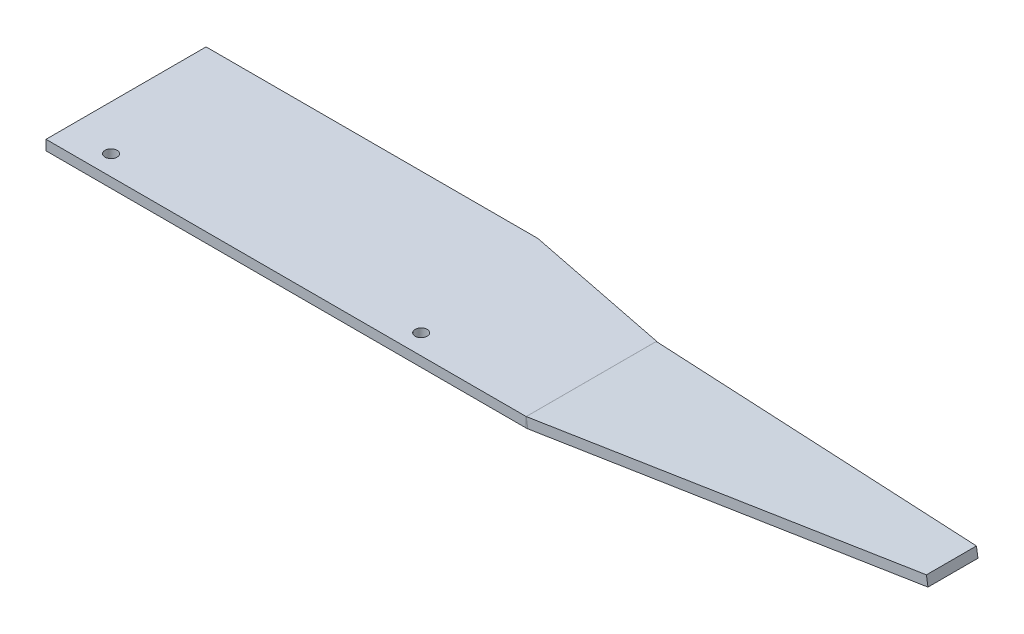
ISO-10303-21;
HEADER;
FILE_DESCRIPTION(('STEP AP214'),'2;1');
FILE_NAME('part.step','',(''),(''),'','','');
FILE_SCHEMA(('AUTOMOTIVE_DESIGN { 1 0 10303 214 1 1 1 1 }'));
ENDSEC;
DATA;
#1=APPLICATION_CONTEXT('core data for automotive mechanical design processes');
#2=APPLICATION_PROTOCOL_DEFINITION('international standard','automotive_design',2000,#1);
#3=PRODUCT_CONTEXT('',#1,'mechanical');
#4=PRODUCT('Part','Part','',(#3));
#5=PRODUCT_RELATED_PRODUCT_CATEGORY('part','',(#4));
#6=PRODUCT_DEFINITION_FORMATION('','',#4);
#7=PRODUCT_DEFINITION_CONTEXT('part definition',#1,'design');
#8=PRODUCT_DEFINITION('design','',#6,#7);
#9=PRODUCT_DEFINITION_SHAPE('','',#8);
#10=(LENGTH_UNIT() NAMED_UNIT(*) SI_UNIT(.MILLI.,.METRE.));
#11=(NAMED_UNIT(*) PLANE_ANGLE_UNIT() SI_UNIT($,.RADIAN.));
#12=(NAMED_UNIT(*) SI_UNIT($,.STERADIAN.) SOLID_ANGLE_UNIT());
#13=UNCERTAINTY_MEASURE_WITH_UNIT(LENGTH_MEASURE(1.E-05),#10,'distance_accuracy_value','');
#14=(GEOMETRIC_REPRESENTATION_CONTEXT(3) GLOBAL_UNCERTAINTY_ASSIGNED_CONTEXT((#13)) GLOBAL_UNIT_ASSIGNED_CONTEXT((#10,
#11,#12)) REPRESENTATION_CONTEXT('',''));
#15=CARTESIAN_POINT('',(0.,0.,0.));
#16=DIRECTION('',(0.,0.,1.));
#17=DIRECTION('',(1.,0.,0.));
#18=AXIS2_PLACEMENT_3D('',#15,#16,#17);
#19=CARTESIAN_POINT('',(373.835420222759,409.092570014231,80.));
#20=DIRECTION('',(0.,0.,1.));
#21=DIRECTION('',(0.987822962378464,0.155582116574608,0.));
#22=AXIS2_PLACEMENT_3D('',#19,#20,#21);
#23=PLANE('',#22);
#24=DIRECTION('',(0.987822962378464,0.155582116574608,0.));
#25=VECTOR('',#24,1.);
#26=CARTESIAN_POINT('',(240.391337959967,-47.5,80.));
#27=LINE('',#26,#25);
#28=CARTESIAN_POINT('',(240.785642035331,-47.4378971081301,80.));
#29=VERTEX_POINT('',#28);
#30=CARTESIAN_POINT('',(440.777910582873,-15.9391148118922,80.));
#31=VERTEX_POINT('',#30);
#32=EDGE_CURVE('E69',#29,#31,#27,.T.);
#33=ORIENTED_EDGE('',*,*,#32,.T.);
#34=DIRECTION('',(0.155582116574608,-0.987822962378464,0.));
#35=VECTOR('',#34,1.);
#36=CARTESIAN_POINT('',(373.835420222759,409.092570014231,80.));
#37=LINE('',#36,#35);
#38=CARTESIAN_POINT('',(440.,-10.9999999999999,80.));
#39=VERTEX_POINT('',#38);
#40=EDGE_CURVE('E232',#39,#31,#37,.T.);
#41=ORIENTED_EDGE('',*,*,#40,.F.);
#42=DIRECTION('',(-0.987822962378464,-0.155582116574608,0.));
#43=VECTOR('',#42,1.);
#44=CARTESIAN_POINT('',(440.,-11.,80.));
#45=LINE('',#44,#43);
#46=CARTESIAN_POINT('',(240.007731452458,-42.4987822962378,80.));
#47=VERTEX_POINT('',#46);
#48=EDGE_CURVE('E250',#39,#47,#45,.T.);
#49=ORIENTED_EDGE('',*,*,#48,.T.);
#50=DIRECTION('',(0.155582116574608,-0.987822962378464,0.));
#51=VECTOR('',#50,1.);
#52=CARTESIAN_POINT('',(173.843151675217,377.593787717993,80.));
#53=LINE('',#52,#51);
#54=EDGE_CURVE('E237',#47,#29,#53,.T.);
#55=ORIENTED_EDGE('',*,*,#54,.T.);
#56=EDGE_LOOP('',(#33,#41,#49,#55));
#57=FACE_BOUND('',#56,.T.);
#58=ADVANCED_FACE('F51',(#57),#23,.T.);
#59=CARTESIAN_POINT('',(373.835420222759,409.092570014231,80.));
#60=DIRECTION('',(-0.987822962378464,-0.155582116574608,0.));
#61=DIRECTION('',(0.155582116574608,-0.987822962378464,0.));
#62=AXIS2_PLACEMENT_3D('',#59,#60,#61);
#63=PLANE('',#62);
#64=ORIENTED_EDGE('',*,*,#40,.T.);
#65=DIRECTION('',(0.,0.,-1.));
#66=VECTOR('',#65,1.);
#67=CARTESIAN_POINT('',(440.777910582873,-15.9391148118923,80.));
#68=LINE('',#67,#66);
#69=CARTESIAN_POINT('',(440.777910582873,-15.9391148118923,55.));
#70=VERTEX_POINT('',#69);
#71=EDGE_CURVE('E234',#31,#70,#68,.T.);
#72=ORIENTED_EDGE('',*,*,#71,.T.);
#73=DIRECTION('',(0.155582116574608,-0.987822962378464,0.));
#74=VECTOR('',#73,1.);
#75=CARTESIAN_POINT('',(373.835420222759,409.092570014231,55.));
#76=LINE('',#75,#74);
#77=CARTESIAN_POINT('',(440.,-10.9999999999999,55.));
#78=VERTEX_POINT('',#77);
#79=EDGE_CURVE('E238',#78,#70,#76,.T.);
#80=ORIENTED_EDGE('',*,*,#79,.F.);
#81=DIRECTION('',(0.,0.,-1.));
#82=VECTOR('',#81,1.);
#83=CARTESIAN_POINT('',(440.,-11.,80.));
#84=LINE('',#83,#82);
#85=EDGE_CURVE('E76',#39,#78,#84,.T.);
#86=ORIENTED_EDGE('',*,*,#85,.F.);
#87=EDGE_LOOP('',(#64,#72,#80,#86));
#88=FACE_BOUND('',#87,.T.);
#89=ADVANCED_FACE('F225',(#88),#63,.F.);
#90=CARTESIAN_POINT('',(185.672163254617,379.456857041748,17.3673486063717));
#91=DIRECTION('',(0.191458131933747,0.0301546557795652,-0.981037451095143));
#92=DIRECTION('',(-0.969091321145022,-0.152631883080341,-0.193818264229004));
#93=AXIS2_PLACEMENT_3D('',#90,#91,#92);
#94=PLANE('',#93);
#95=DIRECTION('',(0.969091321145022,0.152631883080341,0.193818264229004));
#96=VECTOR('',#95,1.);
#97=CARTESIAN_POINT('',(252.614653614732,-45.5748277843746,17.3673486063717));
#98=LINE('',#97,#96);
#99=CARTESIAN_POINT('',(240.785642035331,-47.4378971081301,15.0015462904916));
#100=VERTEX_POINT('',#99);
#101=EDGE_CURVE('E11',#100,#70,#98,.T.);
#102=ORIENTED_EDGE('',*,*,#101,.F.);
#103=CARTESIAN_POINT('',(240.007731452458,-42.4987822962378,15.0015462904916));
#104=CARTESIAN_POINT('',(240.785642035331,-47.4378971081302,15.0015462904916));
#105=B_SPLINE_CURVE_WITH_KNOTS('',1,(#103,#104),.UNSPECIFIED.,.F.,.F.,(2,2),(0.,1.),.UNSPECIFIED.);
#106=CARTESIAN_POINT('',(240.007731452458,-42.4987822962378,15.0015462904916));
#107=VERTEX_POINT('',#106);
#108=EDGE_CURVE('E254',#107,#100,#105,.T.);
#109=ORIENTED_EDGE('',*,*,#108,.F.);
#110=DIRECTION('',(-0.969091321145022,-0.152631883080341,-0.193818264229004));
#111=VECTOR('',#110,1.);
#112=CARTESIAN_POINT('',(251.836743031859,-40.6357129724822,17.3673486063717));
#113=LINE('',#112,#111);
#114=EDGE_CURVE('E61',#78,#107,#113,.T.);
#115=ORIENTED_EDGE('',*,*,#114,.F.);
#116=ORIENTED_EDGE('',*,*,#79,.T.);
#117=EDGE_LOOP('',(#102,#109,#115,#116));
#118=FACE_BOUND('',#117,.T.);
#119=ADVANCED_FACE('F221',(#118),#94,.T.);
#120=CARTESIAN_POINT('',(440.,-11.,80.));
#121=DIRECTION('',(0.155582116574608,-0.987822962378464,0.));
#122=DIRECTION('',(0.987822962378464,0.155582116574608,0.));
#123=AXIS2_PLACEMENT_3D('',#120,#121,#122);
#124=PLANE('',#123);
#125=ORIENTED_EDGE('',*,*,#114,.T.);
#126=DIRECTION('',(0.,0.,1.));
#127=VECTOR('',#126,1.);
#128=CARTESIAN_POINT('',(240.007731452458,-42.4987822962378,80.));
#129=LINE('',#128,#127);
#130=EDGE_CURVE('E253',#107,#47,#129,.T.);
#131=ORIENTED_EDGE('',*,*,#130,.T.);
#132=ORIENTED_EDGE('',*,*,#48,.F.);
#133=ORIENTED_EDGE('',*,*,#85,.T.);
#134=EDGE_LOOP('',(#125,#131,#132,#133));
#135=FACE_BOUND('',#134,.T.);
#136=ADVANCED_FACE('F218',(#135),#124,.F.);
#137=CARTESIAN_POINT('',(240.391337959967,-47.5,80.));
#138=DIRECTION('',(-0.155582116574608,0.987822962378464,0.));
#139=DIRECTION('',(-0.987822962378464,-0.155582116574608,0.));
#140=AXIS2_PLACEMENT_3D('',#137,#138,#139);
#141=PLANE('',#140);
#142=ORIENTED_EDGE('',*,*,#32,.F.);
#143=DIRECTION('',(0.,0.,-1.));
#144=VECTOR('',#143,1.);
#145=CARTESIAN_POINT('',(240.785642035331,-47.4378971081302,80.));
#146=LINE('',#145,#144);
#147=EDGE_CURVE('E152',#29,#100,#146,.T.);
#148=ORIENTED_EDGE('',*,*,#147,.T.);
#149=ORIENTED_EDGE('',*,*,#101,.T.);
#150=ORIENTED_EDGE('',*,*,#71,.F.);
#151=EDGE_LOOP('',(#142,#148,#149,#150));
#152=FACE_BOUND('',#151,.T.);
#153=ADVANCED_FACE('F214',(#152),#141,.F.);
#154=CARTESIAN_POINT('',(0.,463.449575419695,80.));
#155=DIRECTION('',(-1.,0.,0.));
#156=DIRECTION('',(0.,-1.,0.));
#157=AXIS2_PLACEMENT_3D('',#154,#155,#156);
#158=PLANE('',#157);
#159=DIRECTION('',(0.,0.,-1.));
#160=VECTOR('',#159,1.);
#161=CARTESIAN_POINT('',(0.,-47.5,80.));
#162=LINE('',#161,#160);
#163=CARTESIAN_POINT('',(0.,-47.5,80.));
#164=VERTEX_POINT('',#163);
#165=CARTESIAN_POINT('',(0.,-47.5,0.));
#166=VERTEX_POINT('',#165);
#167=EDGE_CURVE('E366',#164,#166,#162,.T.);
#168=ORIENTED_EDGE('',*,*,#167,.F.);
#169=DIRECTION('',(0.,-1.,0.));
#170=VECTOR('',#169,1.);
#171=CARTESIAN_POINT('',(0.,463.449575419695,80.));
#172=LINE('',#171,#170);
#173=CARTESIAN_POINT('',(0.,-42.5,80.));
#174=VERTEX_POINT('',#173);
#175=EDGE_CURVE('E161',#174,#164,#172,.T.);
#176=ORIENTED_EDGE('',*,*,#175,.F.);
#177=DIRECTION('',(0.,0.,-1.));
#178=VECTOR('',#177,1.);
#179=CARTESIAN_POINT('',(0.,-42.5,80.));
#180=LINE('',#179,#178);
#181=CARTESIAN_POINT('',(0.,-42.5,0.));
#182=VERTEX_POINT('',#181);
#183=EDGE_CURVE('E173',#174,#182,#180,.T.);
#184=ORIENTED_EDGE('',*,*,#183,.T.);
#185=DIRECTION('',(0.,-1.,0.));
#186=VECTOR('',#185,1.);
#187=CARTESIAN_POINT('',(0.,463.449575419695,0.));
#188=LINE('',#187,#186);
#189=EDGE_CURVE('E178',#182,#166,#188,.T.);
#190=ORIENTED_EDGE('',*,*,#189,.T.);
#191=EDGE_LOOP('',(#168,#176,#184,#190));
#192=FACE_BOUND('',#191,.T.);
#193=ADVANCED_FACE('F217',(#192),#158,.T.);
#194=CARTESIAN_POINT('',(240.,463.449575419695,0.));
#195=DIRECTION('',(0.,0.,1.));
#196=DIRECTION('',(1.,0.,0.));
#197=AXIS2_PLACEMENT_3D('',#194,#195,#196);
#198=PLANE('',#197);
#199=DIRECTION('',(0.,-1.,0.));
#200=VECTOR('',#199,1.);
#201=CARTESIAN_POINT('',(165.777910582873,463.449575419695,0.));
#202=LINE('',#201,#200);
#203=CARTESIAN_POINT('',(165.777910582873,-42.5,0.));
#204=VERTEX_POINT('',#203);
#205=CARTESIAN_POINT('',(165.777910582873,-47.5,0.));
#206=VERTEX_POINT('',#205);
#207=EDGE_CURVE('E373',#204,#206,#202,.T.);
#208=ORIENTED_EDGE('',*,*,#207,.T.);
#209=DIRECTION('',(1.,0.,0.));
#210=VECTOR('',#209,1.);
#211=CARTESIAN_POINT('',(0.,-47.5,0.));
#212=LINE('',#211,#210);
#213=EDGE_CURVE('E166',#166,#206,#212,.T.);
#214=ORIENTED_EDGE('',*,*,#213,.F.);
#215=ORIENTED_EDGE('',*,*,#189,.F.);
#216=DIRECTION('',(-1.,0.,0.));
#217=VECTOR('',#216,1.);
#218=CARTESIAN_POINT('',(240.,-42.5,0.));
#219=LINE('',#218,#217);
#220=EDGE_CURVE('E369',#204,#182,#219,.T.);
#221=ORIENTED_EDGE('',*,*,#220,.F.);
#222=EDGE_LOOP('',(#208,#214,#215,#221));
#223=FACE_BOUND('',#222,.T.);
#224=ADVANCED_FACE('F380',(#223),#198,.F.);
#225=CARTESIAN_POINT('',(240.,-42.5,80.));
#226=DIRECTION('',(0.,-1.,0.));
#227=DIRECTION('',(1.,0.,0.));
#228=AXIS2_PLACEMENT_3D('',#225,#226,#227);
#229=PLANE('',#228);
#230=CARTESIAN_POINT('',(22.5,-42.5,70.));
#231=DIRECTION('',(0.,-1.,0.));
#232=DIRECTION('',(1.,0.,0.));
#233=AXIS2_PLACEMENT_3D('',#230,#231,#232);
#234=CIRCLE('',#233,3.);
#235=CARTESIAN_POINT('',(25.5,-42.5,70.));
#236=VERTEX_POINT('',#235);
#237=EDGE_CURVE('E282',#236,#236,#234,.T.);
#238=ORIENTED_EDGE('',*,*,#237,.T.);
#239=EDGE_LOOP('',(#238));
#240=FACE_BOUND('',#239,.T.);
#241=CARTESIAN_POINT('',(177.5,-42.5,70.));
#242=DIRECTION('',(0.,-1.,0.));
#243=DIRECTION('',(1.,0.,0.));
#244=AXIS2_PLACEMENT_3D('',#241,#242,#243);
#245=CIRCLE('',#244,2.99999999999999);
#246=CARTESIAN_POINT('',(180.5,-42.5,70.));
#247=VERTEX_POINT('',#246);
#248=EDGE_CURVE('E286',#247,#247,#245,.T.);
#249=ORIENTED_EDGE('',*,*,#248,.T.);
#250=EDGE_LOOP('',(#249));
#251=FACE_BOUND('',#250,.T.);
#252=DIRECTION('',(0.,0.,1.));
#253=VECTOR('',#252,1.);
#254=CARTESIAN_POINT('',(239.992173240801,-42.5,80.));
#255=LINE('',#254,#253);
#256=CARTESIAN_POINT('',(239.992173240801,-42.5,14.8428525315855));
#257=VERTEX_POINT('',#256);
#258=CARTESIAN_POINT('',(239.992173240801,-42.5,80.));
#259=VERTEX_POINT('',#258);
#260=EDGE_CURVE('E145',#257,#259,#255,.T.);
#261=ORIENTED_EDGE('',*,*,#260,.F.);
#262=DIRECTION('',(-0.98058067569092,0.,-0.196116135138184));
#263=VECTOR('',#262,1.);
#264=CARTESIAN_POINT('',(252.529919637803,-42.5,17.3504018109859));
#265=LINE('',#264,#263);
#266=EDGE_CURVE('E195',#257,#204,#265,.T.);
#267=ORIENTED_EDGE('',*,*,#266,.T.);
#268=ORIENTED_EDGE('',*,*,#220,.T.);
#269=ORIENTED_EDGE('',*,*,#183,.F.);
#270=DIRECTION('',(-1.,0.,0.));
#271=VECTOR('',#270,1.);
#272=CARTESIAN_POINT('',(240.,-42.5,80.));
#273=LINE('',#272,#271);
#274=EDGE_CURVE('E165',#259,#174,#273,.T.);
#275=ORIENTED_EDGE('',*,*,#274,.F.);
#276=EDGE_LOOP('',(#261,#267,#268,#269,#275));
#277=FACE_BOUND('',#276,.T.);
#278=ADVANCED_FACE('F207',(#240,#251,#277),#229,.F.);
#279=CARTESIAN_POINT('',(252.529919637803,463.449575419695,17.3504018109859));
#280=DIRECTION('',(-0.196116135138184,0.,0.98058067569092));
#281=DIRECTION('',(0.98058067569092,0.,0.196116135138184));
#282=AXIS2_PLACEMENT_3D('',#279,#280,#281);
#283=PLANE('',#282);
#284=CARTESIAN_POINT('',(239.992173240801,-47.5,14.8428525315855));
#285=CARTESIAN_POINT('',(239.992173240801,-42.5,14.8428525315855));
#286=B_SPLINE_CURVE_WITH_KNOTS('',1,(#284,#285),.UNSPECIFIED.,.F.,.F.,(2,2),(0.,1.),.UNSPECIFIED.);
#287=CARTESIAN_POINT('',(239.992173240801,-47.5,14.8428525315855));
#288=VERTEX_POINT('',#287);
#289=EDGE_CURVE('E190',#257,#288,#286,.F.);
#290=ORIENTED_EDGE('',*,*,#289,.T.);
#291=DIRECTION('',(-0.98058067569092,0.,-0.196116135138184));
#292=VECTOR('',#291,1.);
#293=CARTESIAN_POINT('',(440.777910582873,-47.5,55.));
#294=LINE('',#293,#292);
#295=EDGE_CURVE('E171',#288,#206,#294,.T.);
#296=ORIENTED_EDGE('',*,*,#295,.T.);
#297=ORIENTED_EDGE('',*,*,#207,.F.);
#298=ORIENTED_EDGE('',*,*,#266,.F.);
#299=EDGE_LOOP('',(#290,#296,#297,#298));
#300=FACE_BOUND('',#299,.T.);
#301=ADVANCED_FACE('F197',(#300),#283,.F.);
#302=CARTESIAN_POINT('',(0.,-47.5,80.));
#303=DIRECTION('',(0.,1.,0.));
#304=DIRECTION('',(0.,0.,1.));
#305=AXIS2_PLACEMENT_3D('',#302,#303,#304);
#306=PLANE('',#305);
#307=CARTESIAN_POINT('',(22.5,-47.5,70.));
#308=DIRECTION('',(0.,-1.,0.));
#309=DIRECTION('',(0.,0.,-1.));
#310=AXIS2_PLACEMENT_3D('',#307,#308,#309);
#311=CIRCLE('',#310,3.);
#312=CARTESIAN_POINT('',(22.5,-47.5,67.));
#313=VERTEX_POINT('',#312);
#314=EDGE_CURVE('E397',#313,#313,#311,.T.);
#315=ORIENTED_EDGE('',*,*,#314,.F.);
#316=EDGE_LOOP('',(#315));
#317=FACE_BOUND('',#316,.T.);
#318=CARTESIAN_POINT('',(177.5,-47.5,70.));
#319=DIRECTION('',(0.,-1.,0.));
#320=DIRECTION('',(0.,0.,-1.));
#321=AXIS2_PLACEMENT_3D('',#318,#319,#320);
#322=CIRCLE('',#321,2.99999999999999);
#323=CARTESIAN_POINT('',(177.5,-47.5,67.));
#324=VERTEX_POINT('',#323);
#325=EDGE_CURVE('E401',#324,#324,#322,.T.);
#326=ORIENTED_EDGE('',*,*,#325,.F.);
#327=EDGE_LOOP('',(#326));
#328=FACE_BOUND('',#327,.T.);
#329=DIRECTION('',(0.,0.,-1.));
#330=VECTOR('',#329,1.);
#331=CARTESIAN_POINT('',(239.992173240801,-47.5,80.));
#332=LINE('',#331,#330);
#333=CARTESIAN_POINT('',(239.992173240801,-47.5,80.));
#334=VERTEX_POINT('',#333);
#335=EDGE_CURVE('E144',#334,#288,#332,.T.);
#336=ORIENTED_EDGE('',*,*,#335,.F.);
#337=DIRECTION('',(1.,0.,0.));
#338=VECTOR('',#337,1.);
#339=CARTESIAN_POINT('',(0.,-47.5,80.));
#340=LINE('',#339,#338);
#341=EDGE_CURVE('E159',#164,#334,#340,.T.);
#342=ORIENTED_EDGE('',*,*,#341,.F.);
#343=ORIENTED_EDGE('',*,*,#167,.T.);
#344=ORIENTED_EDGE('',*,*,#213,.T.);
#345=ORIENTED_EDGE('',*,*,#295,.F.);
#346=EDGE_LOOP('',(#336,#342,#343,#344,#345));
#347=FACE_BOUND('',#346,.T.);
#348=ADVANCED_FACE('F169',(#317,#328,#347),#306,.F.);
#349=CARTESIAN_POINT('',(240.,463.449575419695,80.));
#350=DIRECTION('',(0.,0.,1.));
#351=DIRECTION('',(1.,0.,0.));
#352=AXIS2_PLACEMENT_3D('',#349,#350,#351);
#353=PLANE('',#352);
#354=ORIENTED_EDGE('',*,*,#341,.T.);
#355=DIRECTION('',(0.,-1.,0.));
#356=VECTOR('',#355,1.);
#357=CARTESIAN_POINT('',(239.992173240801,463.449575419695,80.));
#358=LINE('',#357,#356);
#359=EDGE_CURVE('E133',#259,#334,#358,.T.);
#360=ORIENTED_EDGE('',*,*,#359,.F.);
#361=ORIENTED_EDGE('',*,*,#274,.T.);
#362=ORIENTED_EDGE('',*,*,#175,.T.);
#363=EDGE_LOOP('',(#354,#360,#361,#362));
#364=FACE_BOUND('',#363,.T.);
#365=ADVANCED_FACE('F160',(#364),#353,.T.);
#366=CARTESIAN_POINT('',(239.992173240801,-42.4,80.));
#367=DIRECTION('',(0.,0.,1.));
#368=DIRECTION('',(0.,-1.,0.));
#369=AXIS2_PLACEMENT_3D('',#366,#367,#368);
#370=PLANE('',#369);
#371=ORIENTED_EDGE('',*,*,#54,.F.);
#372=CARTESIAN_POINT('',(239.992173240801,-42.4,80.));
#373=DIRECTION('',(0.,0.,-1.));
#374=DIRECTION('',(0.,1.,0.));
#375=AXIS2_PLACEMENT_3D('',#372,#373,#374);
#376=CIRCLE('',#375,0.0999999999999968);
#377=EDGE_CURVE('E138',#47,#259,#376,.T.);
#378=ORIENTED_EDGE('',*,*,#377,.T.);
#379=ORIENTED_EDGE('',*,*,#359,.T.);
#380=CARTESIAN_POINT('',(239.992173240801,-42.4,80.));
#381=DIRECTION('',(0.,0.,-1.));
#382=DIRECTION('',(0.,1.,0.));
#383=AXIS2_PLACEMENT_3D('',#380,#381,#382);
#384=CIRCLE('',#383,5.1);
#385=EDGE_CURVE('E136',#29,#334,#384,.T.);
#386=ORIENTED_EDGE('',*,*,#385,.F.);
#387=EDGE_LOOP('',(#371,#378,#379,#386));
#388=FACE_BOUND('',#387,.T.);
#389=ADVANCED_FACE('F135',(#388),#370,.T.);
#390=CARTESIAN_POINT('',(239.992173240801,-47.5,14.8428525315855));
#391=CARTESIAN_POINT('',(240.257746170236,-47.5,14.8957513491742));
#392=CARTESIAN_POINT('',(240.523302997449,-47.4792155065966,14.9486474729028));
#393=CARTESIAN_POINT('',(240.785642035331,-47.4378971081302,15.0015462904916));
#394=CARTESIAN_POINT('',(239.992173240801,-42.5,14.8428525315855));
#395=CARTESIAN_POINT('',(239.997380465662,-42.5,14.895750460494));
#396=CARTESIAN_POINT('',(240.00258763617,-42.4995924473032,14.948648361583));
#397=CARTESIAN_POINT('',(240.007731452458,-42.4987822962378,15.0015462904916));
#398=B_SPLINE_SURFACE_WITH_KNOTS('',1,3,((#390,#391,#392,#393),(#394,#395,#396,#397)),
.UNSPECIFIED.,.F.,.F.,.F.,(2,2),(4,4),(0.,1.),(0.,1.),.UNSPECIFIED.);
#399=CARTESIAN_POINT('',(239.992173240801,-42.5,14.8428525315855));
#400=CARTESIAN_POINT('',(239.997380465662,-42.5,14.895750460494));
#401=CARTESIAN_POINT('',(240.00258763617,-42.4995924473032,14.948648361583));
#402=CARTESIAN_POINT('',(240.007731452458,-42.4987822962378,15.0015462904916));
#403=B_SPLINE_CURVE_WITH_KNOTS('',3,(#399,#400,#401,#402),.UNSPECIFIED.,.F.,.F.,(4,4),(0.,1.),.UNSPECIFIED.);
#404=EDGE_CURVE('E155',#257,#107,#403,.T.);
#405=CARTESIAN_POINT('',(240.785642035331,-47.4378971081302,15.0015462904916));
#406=CARTESIAN_POINT('',(240.523302997449,-47.4792155065966,14.9486474729028));
#407=CARTESIAN_POINT('',(240.257746170236,-47.5,14.8957513491742));
#408=CARTESIAN_POINT('',(239.992173240801,-47.5,14.8428525315855));
#409=B_SPLINE_CURVE_WITH_KNOTS('',3,(#405,#406,#407,#408),.UNSPECIFIED.,.F.,.F.,(4,4),(0.,1.),.UNSPECIFIED.);
#410=EDGE_CURVE('E154',#288,#100,#409,.F.);
#411=ORIENTED_EDGE('',*,*,#404,.T.);
#412=ORIENTED_EDGE('',*,*,#108,.T.);
#413=ORIENTED_EDGE('',*,*,#410,.F.);
#414=ORIENTED_EDGE('',*,*,#289,.F.);
#415=EDGE_LOOP('',(#411,#412,#413,#414));
#416=FACE_BOUND('',#415,.T.);
#417=ADVANCED_FACE('F303',(#416),#398,.T.);
#418=CARTESIAN_POINT('',(239.992173240801,-42.3999999999999,530.051533486772));
#419=DIRECTION('',(0.,0.,-1.));
#420=DIRECTION('',(0.,1.,0.));
#421=AXIS2_PLACEMENT_3D('',#418,#419,#420);
#422=CYLINDRICAL_SURFACE('',#421,5.1);
#423=ORIENTED_EDGE('',*,*,#335,.T.);
#424=ORIENTED_EDGE('',*,*,#410,.T.);
#425=ORIENTED_EDGE('',*,*,#147,.F.);
#426=ORIENTED_EDGE('',*,*,#385,.T.);
#427=EDGE_LOOP('',(#423,#424,#425,#426));
#428=FACE_BOUND('',#427,.T.);
#429=ADVANCED_FACE('F148',(#428),#422,.T.);
#430=CARTESIAN_POINT('',(239.992173240801,-42.3999999999999,530.051533486772));
#431=DIRECTION('',(0.,0.,-1.));
#432=DIRECTION('',(0.,1.,0.));
#433=AXIS2_PLACEMENT_3D('',#430,#431,#432);
#434=CYLINDRICAL_SURFACE('',#433,0.0999999999999968);
#435=ORIENTED_EDGE('',*,*,#260,.T.);
#436=ORIENTED_EDGE('',*,*,#377,.F.);
#437=ORIENTED_EDGE('',*,*,#130,.F.);
#438=ORIENTED_EDGE('',*,*,#404,.F.);
#439=EDGE_LOOP('',(#435,#436,#437,#438));
#440=FACE_BOUND('',#439,.T.);
#441=ADVANCED_FACE('F277',(#440),#434,.F.);
#442=CARTESIAN_POINT('',(177.5,-10.9999749999999,70.));
#443=DIRECTION('',(0.,-1.,0.));
#444=DIRECTION('',(0.,0.,-1.));
#445=AXIS2_PLACEMENT_3D('',#442,#443,#444);
#446=CYLINDRICAL_SURFACE('',#445,2.99999999999999);
#447=ORIENTED_EDGE('',*,*,#325,.T.);
#448=EDGE_LOOP('',(#447));
#449=FACE_BOUND('',#448,.T.);
#450=ORIENTED_EDGE('',*,*,#248,.F.);
#451=EDGE_LOOP('',(#450));
#452=FACE_BOUND('',#451,.T.);
#453=ADVANCED_FACE('F304',(#449,#452),#446,.F.);
#454=CARTESIAN_POINT('',(22.5,-10.9999749999999,70.));
#455=DIRECTION('',(0.,-1.,0.));
#456=DIRECTION('',(0.,0.,-1.));
#457=AXIS2_PLACEMENT_3D('',#454,#455,#456);
#458=CYLINDRICAL_SURFACE('',#457,3.);
#459=ORIENTED_EDGE('',*,*,#314,.T.);
#460=EDGE_LOOP('',(#459));
#461=FACE_BOUND('',#460,.T.);
#462=ORIENTED_EDGE('',*,*,#237,.F.);
#463=EDGE_LOOP('',(#462));
#464=FACE_BOUND('',#463,.T.);
#465=ADVANCED_FACE('F409',(#461,#464),#458,.F.);
#466=CLOSED_SHELL('',(#58,#89,#119,#136,#153,#193,#224,#278,#301,#348,#365,#389,#417,#429,#441,
#453,#465));
#467=MANIFOLD_SOLID_BREP('B2',#466);
#468=ADVANCED_BREP_SHAPE_REPRESENTATION('',(#18,#467),#14);
#469=SHAPE_DEFINITION_REPRESENTATION(#9,#468);
ENDSEC;
END-ISO-10303-21;
